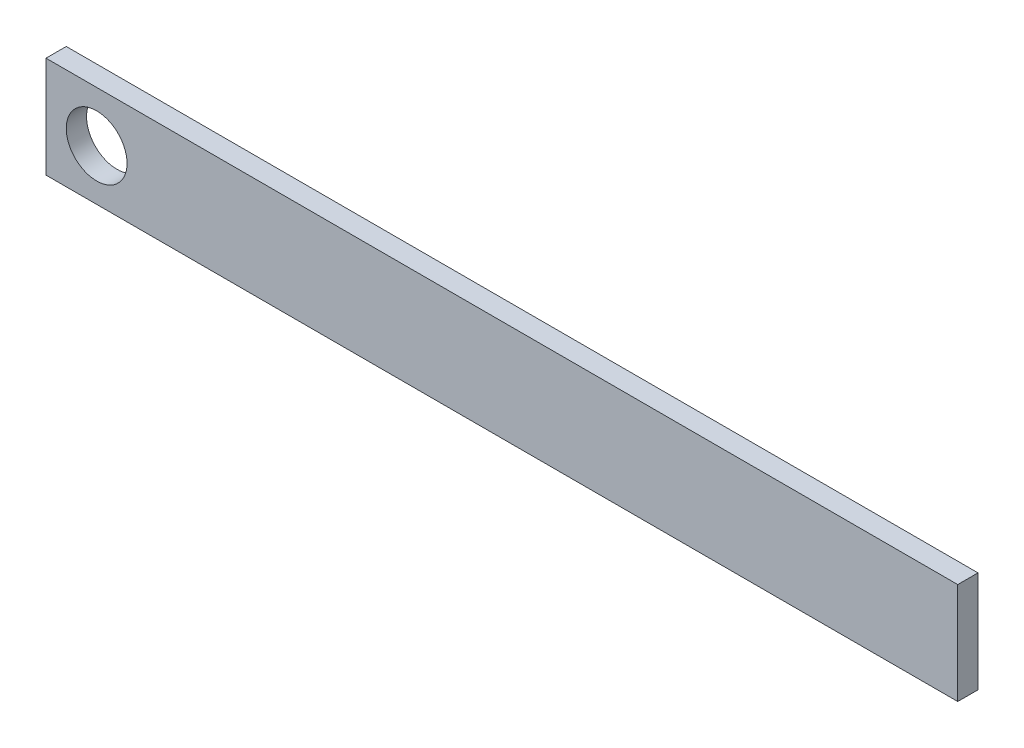
ISO-10303-21;
HEADER;
FILE_DESCRIPTION(('STEP AP214'),'2;1');
FILE_NAME('part.step','',(''),(''),'','','');
FILE_SCHEMA(('AUTOMOTIVE_DESIGN { 1 0 10303 214 1 1 1 1 }'));
ENDSEC;
DATA;
#1=APPLICATION_CONTEXT('core data for automotive mechanical design processes');
#2=APPLICATION_PROTOCOL_DEFINITION('international standard','automotive_design',2000,#1);
#3=PRODUCT_CONTEXT('',#1,'mechanical');
#4=PRODUCT('Part','Part','',(#3));
#5=PRODUCT_RELATED_PRODUCT_CATEGORY('part','',(#4));
#6=PRODUCT_DEFINITION_FORMATION('','',#4);
#7=PRODUCT_DEFINITION_CONTEXT('part definition',#1,'design');
#8=PRODUCT_DEFINITION('design','',#6,#7);
#9=PRODUCT_DEFINITION_SHAPE('','',#8);
#10=(LENGTH_UNIT() NAMED_UNIT(*) SI_UNIT(.MILLI.,.METRE.));
#11=(NAMED_UNIT(*) PLANE_ANGLE_UNIT() SI_UNIT($,.RADIAN.));
#12=(NAMED_UNIT(*) SI_UNIT($,.STERADIAN.) SOLID_ANGLE_UNIT());
#13=UNCERTAINTY_MEASURE_WITH_UNIT(LENGTH_MEASURE(1.E-05),#10,'distance_accuracy_value','');
#14=(GEOMETRIC_REPRESENTATION_CONTEXT(3) GLOBAL_UNCERTAINTY_ASSIGNED_CONTEXT((#13)) GLOBAL_UNIT_ASSIGNED_CONTEXT((#10,
#11,#12)) REPRESENTATION_CONTEXT('',''));
#15=CARTESIAN_POINT('',(0.,0.,0.));
#16=DIRECTION('',(0.,0.,1.));
#17=DIRECTION('',(1.,0.,0.));
#18=AXIS2_PLACEMENT_3D('',#15,#16,#17);
#19=CARTESIAN_POINT('',(0.,0.,1.));
#20=DIRECTION('',(0.,0.,-1.));
#21=DIRECTION('',(-1.,0.,0.));
#22=AXIS2_PLACEMENT_3D('',#19,#20,#21);
#23=PLANE('',#22);
#24=DIRECTION('',(0.,1.,0.));
#25=VECTOR('',#24,1.);
#26=CARTESIAN_POINT('',(32.436974789916,5.00000000000001,1.));
#27=LINE('',#26,#25);
#28=CARTESIAN_POINT('',(32.436974789916,0.,1.));
#29=VERTEX_POINT('',#28);
#30=CARTESIAN_POINT('',(32.436974789916,5.00000000000001,1.));
#31=VERTEX_POINT('',#30);
#32=EDGE_CURVE('E92',#29,#31,#27,.T.);
#33=ORIENTED_EDGE('',*,*,#32,.T.);
#34=DIRECTION('',(-1.,0.,0.));
#35=VECTOR('',#34,1.);
#36=CARTESIAN_POINT('',(32.436974789916,5.00000000000001,1.));
#37=LINE('',#36,#35);
#38=CARTESIAN_POINT('',(-12.563025210084,5.,1.));
#39=VERTEX_POINT('',#38);
#40=EDGE_CURVE('E87',#31,#39,#37,.T.);
#41=ORIENTED_EDGE('',*,*,#40,.T.);
#42=DIRECTION('',(0.,-1.,0.));
#43=VECTOR('',#42,1.);
#44=CARTESIAN_POINT('',(-12.563025210084,5.,1.));
#45=LINE('',#44,#43);
#46=CARTESIAN_POINT('',(-12.563025210084,0.,1.));
#47=VERTEX_POINT('',#46);
#48=EDGE_CURVE('E90',#39,#47,#45,.T.);
#49=ORIENTED_EDGE('',*,*,#48,.T.);
#50=DIRECTION('',(1.,0.,0.));
#51=VECTOR('',#50,1.);
#52=CARTESIAN_POINT('',(32.436974789916,0.,1.));
#53=LINE('',#52,#51);
#54=EDGE_CURVE('E57',#47,#29,#53,.T.);
#55=ORIENTED_EDGE('',*,*,#54,.T.);
#56=EDGE_LOOP('',(#33,#41,#49,#55));
#57=FACE_BOUND('',#56,.T.);
#58=CARTESIAN_POINT('',(-10.063025210084,2.5,1.));
#59=DIRECTION('',(0.,0.,1.));
#60=DIRECTION('',(1.,0.,0.));
#61=AXIS2_PLACEMENT_3D('',#58,#59,#60);
#62=CIRCLE('',#61,1.5);
#63=CARTESIAN_POINT('',(-8.56302521008402,2.5,1.));
#64=VERTEX_POINT('',#63);
#65=EDGE_CURVE('E112',#64,#64,#62,.T.);
#66=ORIENTED_EDGE('',*,*,#65,.F.);
#67=EDGE_LOOP('',(#66));
#68=FACE_BOUND('',#67,.T.);
#69=ADVANCED_FACE('F39',(#57,#68),#23,.F.);
#70=CARTESIAN_POINT('',(0.,0.,0.));
#71=DIRECTION('',(0.,0.,-1.));
#72=DIRECTION('',(-1.,0.,0.));
#73=AXIS2_PLACEMENT_3D('',#70,#71,#72);
#74=PLANE('',#73);
#75=DIRECTION('',(0.,1.,0.));
#76=VECTOR('',#75,1.);
#77=CARTESIAN_POINT('',(32.436974789916,5.00000000000001,0.));
#78=LINE('',#77,#76);
#79=CARTESIAN_POINT('',(32.436974789916,0.,0.));
#80=VERTEX_POINT('',#79);
#81=CARTESIAN_POINT('',(32.436974789916,5.00000000000001,0.));
#82=VERTEX_POINT('',#81);
#83=EDGE_CURVE('E108',#80,#82,#78,.T.);
#84=ORIENTED_EDGE('',*,*,#83,.F.);
#85=DIRECTION('',(1.,0.,0.));
#86=VECTOR('',#85,1.);
#87=CARTESIAN_POINT('',(32.436974789916,0.,0.));
#88=LINE('',#87,#86);
#89=CARTESIAN_POINT('',(-12.563025210084,0.,0.));
#90=VERTEX_POINT('',#89);
#91=EDGE_CURVE('E80',#90,#80,#88,.T.);
#92=ORIENTED_EDGE('',*,*,#91,.F.);
#93=DIRECTION('',(0.,-1.,0.));
#94=VECTOR('',#93,1.);
#95=CARTESIAN_POINT('',(-12.563025210084,5.,0.));
#96=LINE('',#95,#94);
#97=CARTESIAN_POINT('',(-12.563025210084,5.,0.));
#98=VERTEX_POINT('',#97);
#99=EDGE_CURVE('E74',#98,#90,#96,.T.);
#100=ORIENTED_EDGE('',*,*,#99,.F.);
#101=DIRECTION('',(-1.,0.,0.));
#102=VECTOR('',#101,1.);
#103=CARTESIAN_POINT('',(32.436974789916,5.00000000000001,0.));
#104=LINE('',#103,#102);
#105=EDGE_CURVE('E97',#82,#98,#104,.T.);
#106=ORIENTED_EDGE('',*,*,#105,.F.);
#107=EDGE_LOOP('',(#84,#92,#100,#106));
#108=FACE_BOUND('',#107,.T.);
#109=CARTESIAN_POINT('',(-10.063025210084,2.5,0.));
#110=DIRECTION('',(0.,0.,1.));
#111=DIRECTION('',(1.,0.,0.));
#112=AXIS2_PLACEMENT_3D('',#109,#110,#111);
#113=CIRCLE('',#112,1.5);
#114=CARTESIAN_POINT('',(-8.56302521008402,2.5,0.));
#115=VERTEX_POINT('',#114);
#116=EDGE_CURVE('E130',#115,#115,#113,.T.);
#117=ORIENTED_EDGE('',*,*,#116,.T.);
#118=EDGE_LOOP('',(#117));
#119=FACE_BOUND('',#118,.T.);
#120=ADVANCED_FACE('F125',(#108,#119),#74,.T.);
#121=CARTESIAN_POINT('',(32.436974789916,5.00000000000001,1.));
#122=DIRECTION('',(-1.,0.,0.));
#123=DIRECTION('',(0.,0.,1.));
#124=AXIS2_PLACEMENT_3D('',#121,#122,#123);
#125=PLANE('',#124);
#126=ORIENTED_EDGE('',*,*,#83,.T.);
#127=DIRECTION('',(0.,0.,-1.));
#128=VECTOR('',#127,1.);
#129=CARTESIAN_POINT('',(32.436974789916,5.00000000000001,1.));
#130=LINE('',#129,#128);
#131=EDGE_CURVE('E11',#31,#82,#130,.T.);
#132=ORIENTED_EDGE('',*,*,#131,.F.);
#133=ORIENTED_EDGE('',*,*,#32,.F.);
#134=DIRECTION('',(0.,0.,-1.));
#135=VECTOR('',#134,1.);
#136=CARTESIAN_POINT('',(32.436974789916,0.,1.));
#137=LINE('',#136,#135);
#138=EDGE_CURVE('E104',#29,#80,#137,.T.);
#139=ORIENTED_EDGE('',*,*,#138,.T.);
#140=EDGE_LOOP('',(#126,#132,#133,#139));
#141=FACE_BOUND('',#140,.T.);
#142=ADVANCED_FACE('F41',(#141),#125,.F.);
#143=CARTESIAN_POINT('',(32.436974789916,5.00000000000001,1.));
#144=DIRECTION('',(0.,-1.,0.));
#145=DIRECTION('',(1.,0.,0.));
#146=AXIS2_PLACEMENT_3D('',#143,#144,#145);
#147=PLANE('',#146);
#148=ORIENTED_EDGE('',*,*,#105,.T.);
#149=DIRECTION('',(0.,0.,-1.));
#150=VECTOR('',#149,1.);
#151=CARTESIAN_POINT('',(-12.563025210084,5.,1.));
#152=LINE('',#151,#150);
#153=EDGE_CURVE('E49',#39,#98,#152,.T.);
#154=ORIENTED_EDGE('',*,*,#153,.F.);
#155=ORIENTED_EDGE('',*,*,#40,.F.);
#156=ORIENTED_EDGE('',*,*,#131,.T.);
#157=EDGE_LOOP('',(#148,#154,#155,#156));
#158=FACE_BOUND('',#157,.T.);
#159=ADVANCED_FACE('F96',(#158),#147,.F.);
#160=CARTESIAN_POINT('',(-12.563025210084,5.,1.));
#161=DIRECTION('',(1.,0.,0.));
#162=DIRECTION('',(0.,0.,-1.));
#163=AXIS2_PLACEMENT_3D('',#160,#161,#162);
#164=PLANE('',#163);
#165=ORIENTED_EDGE('',*,*,#99,.T.);
#166=DIRECTION('',(0.,0.,-1.));
#167=VECTOR('',#166,1.);
#168=CARTESIAN_POINT('',(-12.563025210084,0.,1.));
#169=LINE('',#168,#167);
#170=EDGE_CURVE('E99',#47,#90,#169,.T.);
#171=ORIENTED_EDGE('',*,*,#170,.F.);
#172=ORIENTED_EDGE('',*,*,#48,.F.);
#173=ORIENTED_EDGE('',*,*,#153,.T.);
#174=EDGE_LOOP('',(#165,#171,#172,#173));
#175=FACE_BOUND('',#174,.T.);
#176=ADVANCED_FACE('F100',(#175),#164,.F.);
#177=CARTESIAN_POINT('',(32.436974789916,0.,1.));
#178=DIRECTION('',(0.,1.,0.));
#179=DIRECTION('',(-1.,0.,0.));
#180=AXIS2_PLACEMENT_3D('',#177,#178,#179);
#181=PLANE('',#180);
#182=ORIENTED_EDGE('',*,*,#91,.T.);
#183=ORIENTED_EDGE('',*,*,#138,.F.);
#184=ORIENTED_EDGE('',*,*,#54,.F.);
#185=ORIENTED_EDGE('',*,*,#170,.T.);
#186=EDGE_LOOP('',(#182,#183,#184,#185));
#187=FACE_BOUND('',#186,.T.);
#188=ADVANCED_FACE('F122',(#187),#181,.F.);
#189=CARTESIAN_POINT('',(-10.063025210084,2.5,1.));
#190=DIRECTION('',(0.,0.,-1.));
#191=DIRECTION('',(-1.,0.,0.));
#192=AXIS2_PLACEMENT_3D('',#189,#190,#191);
#193=CYLINDRICAL_SURFACE('',#192,1.5);
#194=ORIENTED_EDGE('',*,*,#65,.T.);
#195=EDGE_LOOP('',(#194));
#196=FACE_BOUND('',#195,.T.);
#197=ORIENTED_EDGE('',*,*,#116,.F.);
#198=EDGE_LOOP('',(#197));
#199=FACE_BOUND('',#198,.T.);
#200=ADVANCED_FACE('F138',(#196,#199),#193,.F.);
#201=CLOSED_SHELL('',(#69,#120,#142,#159,#176,#188,#200));
#202=MANIFOLD_SOLID_BREP('B2',#201);
#203=ADVANCED_BREP_SHAPE_REPRESENTATION('',(#18,#202),#14);
#204=SHAPE_DEFINITION_REPRESENTATION(#9,#203);
ENDSEC;
END-ISO-10303-21;
